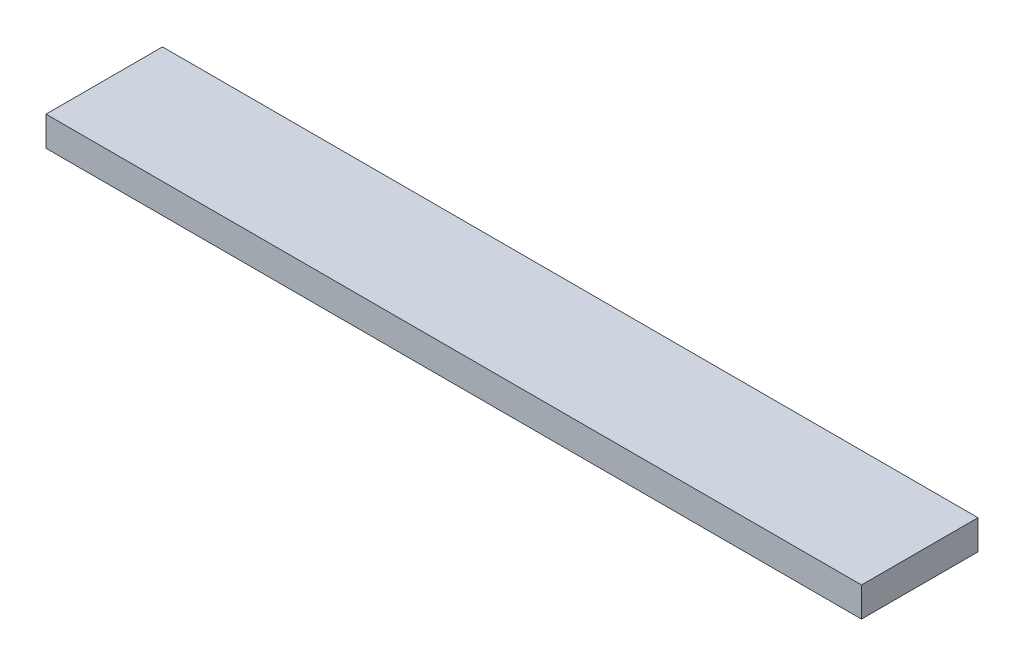
ISO-10303-21;
HEADER;
FILE_DESCRIPTION(('STEP AP214'),'2;1');
FILE_NAME('part.step','',(''),(''),'','','');
FILE_SCHEMA(('AUTOMOTIVE_DESIGN { 1 0 10303 214 1 1 1 1 }'));
ENDSEC;
DATA;
#1=APPLICATION_CONTEXT('core data for automotive mechanical design processes');
#2=APPLICATION_PROTOCOL_DEFINITION('international standard','automotive_design',2000,#1);
#3=PRODUCT_CONTEXT('',#1,'mechanical');
#4=PRODUCT('Part','Part','',(#3));
#5=PRODUCT_RELATED_PRODUCT_CATEGORY('part','',(#4));
#6=PRODUCT_DEFINITION_FORMATION('','',#4);
#7=PRODUCT_DEFINITION_CONTEXT('part definition',#1,'design');
#8=PRODUCT_DEFINITION('design','',#6,#7);
#9=PRODUCT_DEFINITION_SHAPE('','',#8);
#10=(LENGTH_UNIT() NAMED_UNIT(*) SI_UNIT(.MILLI.,.METRE.));
#11=(NAMED_UNIT(*) PLANE_ANGLE_UNIT() SI_UNIT($,.RADIAN.));
#12=(NAMED_UNIT(*) SI_UNIT($,.STERADIAN.) SOLID_ANGLE_UNIT());
#13=UNCERTAINTY_MEASURE_WITH_UNIT(LENGTH_MEASURE(1.E-05),#10,'distance_accuracy_value','');
#14=(GEOMETRIC_REPRESENTATION_CONTEXT(3) GLOBAL_UNCERTAINTY_ASSIGNED_CONTEXT((#13)) GLOBAL_UNIT_ASSIGNED_CONTEXT((#10,
#11,#12)) REPRESENTATION_CONTEXT('',''));
#15=CARTESIAN_POINT('',(0.,0.,0.));
#16=DIRECTION('',(0.,0.,1.));
#17=DIRECTION('',(1.,0.,0.));
#18=AXIS2_PLACEMENT_3D('',#15,#16,#17);
#19=CARTESIAN_POINT('',(-87.5,6.35,-12.5));
#20=DIRECTION('',(1.,0.,0.));
#21=DIRECTION('',(0.,0.,-1.));
#22=AXIS2_PLACEMENT_3D('',#19,#20,#21);
#23=PLANE('',#22);
#24=DIRECTION('',(0.,0.,1.));
#25=VECTOR('',#24,1.);
#26=CARTESIAN_POINT('',(-87.5,0.,-12.5));
#27=LINE('',#26,#25);
#28=CARTESIAN_POINT('',(-87.5,0.,-12.5));
#29=VERTEX_POINT('',#28);
#30=CARTESIAN_POINT('',(-87.5,0.,12.5));
#31=VERTEX_POINT('',#30);
#32=EDGE_CURVE('E107',#29,#31,#27,.T.);
#33=ORIENTED_EDGE('',*,*,#32,.T.);
#34=DIRECTION('',(0.,-1.,0.));
#35=VECTOR('',#34,1.);
#36=CARTESIAN_POINT('',(-87.5,6.35,12.5));
#37=LINE('',#36,#35);
#38=CARTESIAN_POINT('',(-87.5,6.35,12.5));
#39=VERTEX_POINT('',#38);
#40=EDGE_CURVE('E11',#39,#31,#37,.T.);
#41=ORIENTED_EDGE('',*,*,#40,.F.);
#42=DIRECTION('',(0.,0.,1.));
#43=VECTOR('',#42,1.);
#44=CARTESIAN_POINT('',(-87.5,6.35,-12.5));
#45=LINE('',#44,#43);
#46=CARTESIAN_POINT('',(-87.5,6.35,-12.5));
#47=VERTEX_POINT('',#46);
#48=EDGE_CURVE('E91',#47,#39,#45,.T.);
#49=ORIENTED_EDGE('',*,*,#48,.F.);
#50=DIRECTION('',(0.,-1.,0.));
#51=VECTOR('',#50,1.);
#52=CARTESIAN_POINT('',(-87.5,6.35,-12.5));
#53=LINE('',#52,#51);
#54=EDGE_CURVE('E103',#47,#29,#53,.T.);
#55=ORIENTED_EDGE('',*,*,#54,.T.);
#56=EDGE_LOOP('',(#33,#41,#49,#55));
#57=FACE_BOUND('',#56,.T.);
#58=ADVANCED_FACE('F39',(#57),#23,.F.);
#59=CARTESIAN_POINT('',(-87.5,6.35,12.5));
#60=DIRECTION('',(0.,0.,-1.));
#61=DIRECTION('',(-1.,0.,0.));
#62=AXIS2_PLACEMENT_3D('',#59,#60,#61);
#63=PLANE('',#62);
#64=DIRECTION('',(1.,0.,0.));
#65=VECTOR('',#64,1.);
#66=CARTESIAN_POINT('',(-87.5,0.,12.5));
#67=LINE('',#66,#65);
#68=CARTESIAN_POINT('',(87.5,0.,12.5));
#69=VERTEX_POINT('',#68);
#70=EDGE_CURVE('E96',#31,#69,#67,.T.);
#71=ORIENTED_EDGE('',*,*,#70,.T.);
#72=DIRECTION('',(0.,-1.,0.));
#73=VECTOR('',#72,1.);
#74=CARTESIAN_POINT('',(87.5,6.35,12.5));
#75=LINE('',#74,#73);
#76=CARTESIAN_POINT('',(87.5,6.35,12.5));
#77=VERTEX_POINT('',#76);
#78=EDGE_CURVE('E48',#77,#69,#75,.T.);
#79=ORIENTED_EDGE('',*,*,#78,.F.);
#80=DIRECTION('',(1.,0.,0.));
#81=VECTOR('',#80,1.);
#82=CARTESIAN_POINT('',(-87.5,6.35,12.5));
#83=LINE('',#82,#81);
#84=EDGE_CURVE('E86',#39,#77,#83,.T.);
#85=ORIENTED_EDGE('',*,*,#84,.F.);
#86=ORIENTED_EDGE('',*,*,#40,.T.);
#87=EDGE_LOOP('',(#71,#79,#85,#86));
#88=FACE_BOUND('',#87,.T.);
#89=ADVANCED_FACE('F95',(#88),#63,.F.);
#90=CARTESIAN_POINT('',(87.5,6.35,-12.5));
#91=DIRECTION('',(-1.,0.,0.));
#92=DIRECTION('',(0.,0.,1.));
#93=AXIS2_PLACEMENT_3D('',#90,#91,#92);
#94=PLANE('',#93);
#95=DIRECTION('',(0.,0.,-1.));
#96=VECTOR('',#95,1.);
#97=CARTESIAN_POINT('',(87.5,0.,-12.5));
#98=LINE('',#97,#96);
#99=CARTESIAN_POINT('',(87.5,0.,-12.5));
#100=VERTEX_POINT('',#99);
#101=EDGE_CURVE('E73',#69,#100,#98,.T.);
#102=ORIENTED_EDGE('',*,*,#101,.T.);
#103=DIRECTION('',(0.,-1.,0.));
#104=VECTOR('',#103,1.);
#105=CARTESIAN_POINT('',(87.5,6.35,-12.5));
#106=LINE('',#105,#104);
#107=CARTESIAN_POINT('',(87.5,6.35,-12.5));
#108=VERTEX_POINT('',#107);
#109=EDGE_CURVE('E98',#108,#100,#106,.T.);
#110=ORIENTED_EDGE('',*,*,#109,.F.);
#111=DIRECTION('',(0.,0.,-1.));
#112=VECTOR('',#111,1.);
#113=CARTESIAN_POINT('',(87.5,6.35,-12.5));
#114=LINE('',#113,#112);
#115=EDGE_CURVE('E89',#77,#108,#114,.T.);
#116=ORIENTED_EDGE('',*,*,#115,.F.);
#117=ORIENTED_EDGE('',*,*,#78,.T.);
#118=EDGE_LOOP('',(#102,#110,#116,#117));
#119=FACE_BOUND('',#118,.T.);
#120=ADVANCED_FACE('F99',(#119),#94,.F.);
#121=CARTESIAN_POINT('',(-87.5,6.35,-12.5));
#122=DIRECTION('',(0.,0.,1.));
#123=DIRECTION('',(1.,0.,0.));
#124=AXIS2_PLACEMENT_3D('',#121,#122,#123);
#125=PLANE('',#124);
#126=DIRECTION('',(-1.,0.,0.));
#127=VECTOR('',#126,1.);
#128=CARTESIAN_POINT('',(-87.5,0.,-12.5));
#129=LINE('',#128,#127);
#130=EDGE_CURVE('E79',#100,#29,#129,.T.);
#131=ORIENTED_EDGE('',*,*,#130,.T.);
#132=ORIENTED_EDGE('',*,*,#54,.F.);
#133=DIRECTION('',(-1.,0.,0.));
#134=VECTOR('',#133,1.);
#135=CARTESIAN_POINT('',(-87.5,6.35,-12.5));
#136=LINE('',#135,#134);
#137=EDGE_CURVE('E56',#108,#47,#136,.T.);
#138=ORIENTED_EDGE('',*,*,#137,.F.);
#139=ORIENTED_EDGE('',*,*,#109,.T.);
#140=EDGE_LOOP('',(#131,#132,#138,#139));
#141=FACE_BOUND('',#140,.T.);
#142=ADVANCED_FACE('F120',(#141),#125,.F.);
#143=CARTESIAN_POINT('',(0.,6.35,0.));
#144=DIRECTION('',(0.,1.,0.));
#145=DIRECTION('',(0.,0.,1.));
#146=AXIS2_PLACEMENT_3D('',#143,#144,#145);
#147=PLANE('',#146);
#148=ORIENTED_EDGE('',*,*,#48,.T.);
#149=ORIENTED_EDGE('',*,*,#84,.T.);
#150=ORIENTED_EDGE('',*,*,#115,.T.);
#151=ORIENTED_EDGE('',*,*,#137,.T.);
#152=EDGE_LOOP('',(#148,#149,#150,#151));
#153=FACE_BOUND('',#152,.T.);
#154=ADVANCED_FACE('F87',(#153),#147,.T.);
#155=CARTESIAN_POINT('',(0.,0.,0.));
#156=DIRECTION('',(0.,1.,0.));
#157=DIRECTION('',(0.,0.,1.));
#158=AXIS2_PLACEMENT_3D('',#155,#156,#157);
#159=PLANE('',#158);
#160=ORIENTED_EDGE('',*,*,#32,.F.);
#161=ORIENTED_EDGE('',*,*,#130,.F.);
#162=ORIENTED_EDGE('',*,*,#101,.F.);
#163=ORIENTED_EDGE('',*,*,#70,.F.);
#164=EDGE_LOOP('',(#160,#161,#162,#163));
#165=FACE_BOUND('',#164,.T.);
#166=ADVANCED_FACE('F123',(#165),#159,.F.);
#167=CLOSED_SHELL('',(#58,#89,#120,#142,#154,#166));
#168=MANIFOLD_SOLID_BREP('B2',#167);
#169=ADVANCED_BREP_SHAPE_REPRESENTATION('',(#18,#168),#14);
#170=SHAPE_DEFINITION_REPRESENTATION(#9,#169);
ENDSEC;
END-ISO-10303-21;
